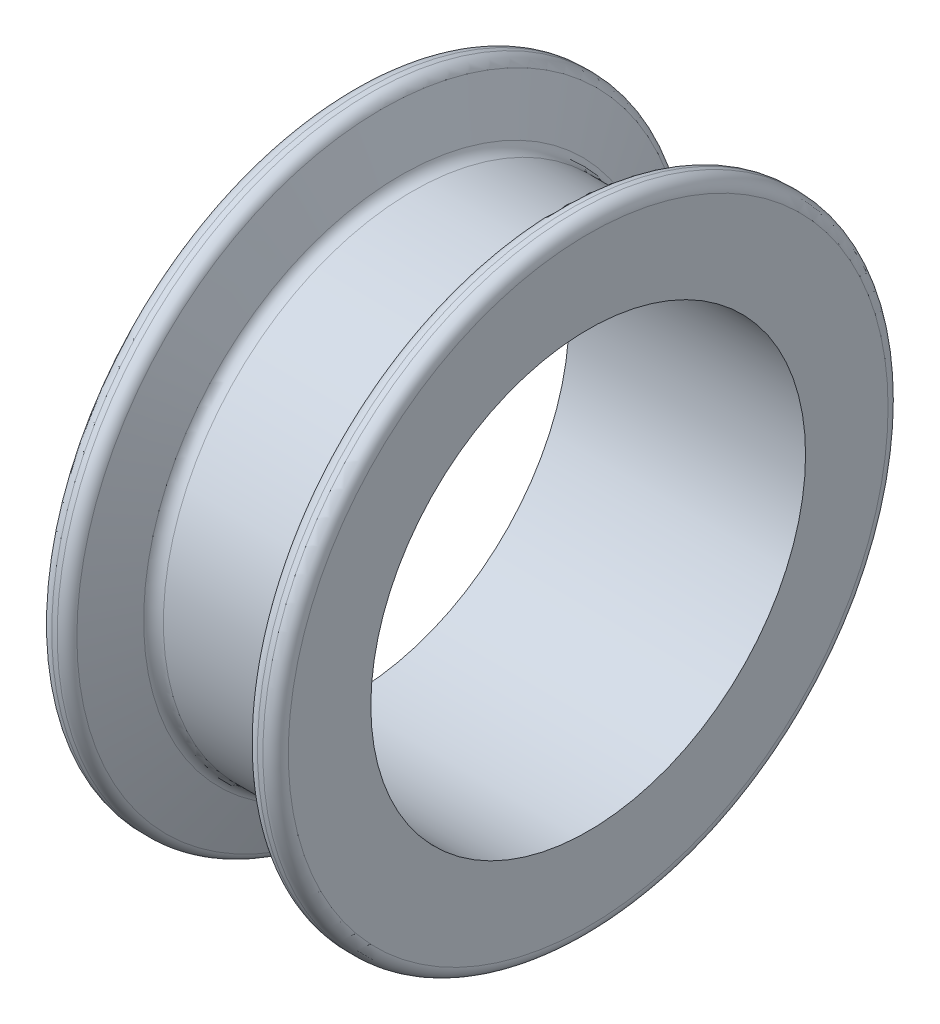
ISO-10303-21;
HEADER;
FILE_DESCRIPTION(('STEP AP214'),'2;1');
FILE_NAME('part.step','',(''),(''),'','','');
FILE_SCHEMA(('AUTOMOTIVE_DESIGN { 1 0 10303 214 1 1 1 1 }'));
ENDSEC;
DATA;
#1=APPLICATION_CONTEXT('core data for automotive mechanical design processes');
#2=APPLICATION_PROTOCOL_DEFINITION('international standard','automotive_design',2000,#1);
#3=PRODUCT_CONTEXT('',#1,'mechanical');
#4=PRODUCT('Part','Part','',(#3));
#5=PRODUCT_RELATED_PRODUCT_CATEGORY('part','',(#4));
#6=PRODUCT_DEFINITION_FORMATION('','',#4);
#7=PRODUCT_DEFINITION_CONTEXT('part definition',#1,'design');
#8=PRODUCT_DEFINITION('design','',#6,#7);
#9=PRODUCT_DEFINITION_SHAPE('','',#8);
#10=(LENGTH_UNIT() NAMED_UNIT(*) SI_UNIT(.MILLI.,.METRE.));
#11=(NAMED_UNIT(*) PLANE_ANGLE_UNIT() SI_UNIT($,.RADIAN.));
#12=(NAMED_UNIT(*) SI_UNIT($,.STERADIAN.) SOLID_ANGLE_UNIT());
#13=UNCERTAINTY_MEASURE_WITH_UNIT(LENGTH_MEASURE(1.E-05),#10,'distance_accuracy_value','');
#14=(GEOMETRIC_REPRESENTATION_CONTEXT(3) GLOBAL_UNCERTAINTY_ASSIGNED_CONTEXT((#13)) GLOBAL_UNIT_ASSIGNED_CONTEXT((#10,
#11,#12)) REPRESENTATION_CONTEXT('',''));
#15=CARTESIAN_POINT('',(0.,0.,0.));
#16=DIRECTION('',(0.,0.,1.));
#17=DIRECTION('',(1.,0.,0.));
#18=AXIS2_PLACEMENT_3D('',#15,#16,#17);
#19=CARTESIAN_POINT('',(215.569737886982,-120.531915067261,0.));
#20=DIRECTION('',(1.,0.,0.));
#21=DIRECTION('',(0.,0.,-1.));
#22=AXIS2_PLACEMENT_3D('',#19,#20,#21);
#23=PLANE('',#22);
#24=CARTESIAN_POINT('',(215.569737886982,-113.681915067259,0.));
#25=DIRECTION('',(1.,0.,0.));
#26=DIRECTION('',(0.,0.,-1.));
#27=AXIS2_PLACEMENT_3D('',#24,#25,#26);
#28=CIRCLE('',#27,9.45000000000008);
#29=CARTESIAN_POINT('',(215.569737886982,-113.681915067259,-9.45000000000008));
#30=VERTEX_POINT('',#29);
#31=EDGE_CURVE('E10',#30,#30,#28,.T.);
#32=ORIENTED_EDGE('',*,*,#31,.F.);
#33=EDGE_LOOP('',(#32));
#34=FACE_BOUND('',#33,.T.);
#35=CARTESIAN_POINT('',(215.569737886982,-113.681915067259,0.));
#36=DIRECTION('',(1.,0.,0.));
#37=DIRECTION('',(0.,0.,-1.));
#38=AXIS2_PLACEMENT_3D('',#35,#36,#37);
#39=CIRCLE('',#38,6.85000000000109);
#40=CARTESIAN_POINT('',(215.569737886982,-113.681915067259,-6.85000000000109));
#41=VERTEX_POINT('',#40);
#42=EDGE_CURVE('E80',#41,#41,#39,.T.);
#43=ORIENTED_EDGE('',*,*,#42,.T.);
#44=EDGE_LOOP('',(#43));
#45=FACE_BOUND('',#44,.T.);
#46=ADVANCED_FACE('F34',(#34,#45),#23,.F.);
#47=CARTESIAN_POINT('',(215.969737886982,-113.681915067259,0.));
#48=DIRECTION('',(1.,0.,0.));
#49=DIRECTION('',(0.,0.,-1.));
#50=AXIS2_PLACEMENT_3D('',#47,#48,#49);
#51=TOROIDAL_SURFACE('',#50,9.45000000000008,0.400000000000018);
#52=CARTESIAN_POINT('',(215.969737886982,-113.681915067259,0.));
#53=DIRECTION('',(1.,0.,0.));
#54=DIRECTION('',(0.,0.,-1.));
#55=AXIS2_PLACEMENT_3D('',#52,#53,#54);
#56=CIRCLE('',#55,9.85000000000008);
#57=CARTESIAN_POINT('',(215.969737886982,-113.681915067259,-9.85000000000008));
#58=VERTEX_POINT('',#57);
#59=EDGE_CURVE('E40',#58,#58,#56,.T.);
#60=ORIENTED_EDGE('',*,*,#59,.F.);
#61=EDGE_LOOP('',(#60));
#62=FACE_BOUND('',#61,.T.);
#63=ORIENTED_EDGE('',*,*,#31,.T.);
#64=EDGE_LOOP('',(#63));
#65=FACE_BOUND('',#64,.T.);
#66=ADVANCED_FACE('F153',(#62,#65),#51,.T.);
#67=CARTESIAN_POINT('',(220.434983076149,-113.681915067259,0.));
#68=DIRECTION('',(1.,0.,0.));
#69=DIRECTION('',(0.,0.,-1.));
#70=AXIS2_PLACEMENT_3D('',#67,#68,#69);
#71=CYLINDRICAL_SURFACE('',#70,9.85000000000008);
#72=CARTESIAN_POINT('',(216.140466235807,-113.681915067259,0.));
#73=DIRECTION('',(1.,0.,0.));
#74=DIRECTION('',(0.,0.,-1.));
#75=AXIS2_PLACEMENT_3D('',#72,#73,#74);
#76=CIRCLE('',#75,9.85000000000008);
#77=CARTESIAN_POINT('',(216.140466235807,-113.681915067259,-9.85000000000008));
#78=VERTEX_POINT('',#77);
#79=EDGE_CURVE('E44',#78,#78,#76,.T.);
#80=ORIENTED_EDGE('',*,*,#79,.F.);
#81=EDGE_LOOP('',(#80));
#82=FACE_BOUND('',#81,.T.);
#83=ORIENTED_EDGE('',*,*,#59,.T.);
#84=EDGE_LOOP('',(#83));
#85=FACE_BOUND('',#84,.T.);
#86=ADVANCED_FACE('F148',(#82,#85),#71,.T.);
#87=CARTESIAN_POINT('',(216.140466235807,-113.681915067259,0.));
#88=DIRECTION('',(1.,0.,0.));
#89=DIRECTION('',(0.,0.,-1.));
#90=AXIS2_PLACEMENT_3D('',#87,#88,#89);
#91=TOROIDAL_SURFACE('',#90,9.45000000000007,0.400000000000011);
#92=CARTESIAN_POINT('',(216.51137731439,-113.681915067259,0.));
#93=DIRECTION('',(1.,0.,0.));
#94=DIRECTION('',(0.,0.,-1.));
#95=AXIS2_PLACEMENT_3D('',#92,#93,#94);
#96=CIRCLE('',#95,9.59974969711037);
#97=CARTESIAN_POINT('',(216.51137731439,-113.681915067259,-9.59974969711037));
#98=VERTEX_POINT('',#97);
#99=EDGE_CURVE('E48',#98,#98,#96,.T.);
#100=ORIENTED_EDGE('',*,*,#99,.F.);
#101=EDGE_LOOP('',(#100));
#102=FACE_BOUND('',#101,.T.);
#103=ORIENTED_EDGE('',*,*,#79,.T.);
#104=EDGE_LOOP('',(#103));
#105=FACE_BOUND('',#104,.T.);
#106=ADVANCED_FACE('F142',(#102,#105),#91,.T.);
#107=CARTESIAN_POINT('',(216.51137731439,-113.681915067259,0.));
#108=DIRECTION('',(-1.,0.,0.));
#109=DIRECTION('',(0.,0.,1.));
#110=AXIS2_PLACEMENT_3D('',#107,#108,#109);
#111=CONICAL_SURFACE('',#110,9.59974969711037,1.18707447691162);
#112=CARTESIAN_POINT('',(217.116777349783,-113.681915067259,0.));
#113=DIRECTION('',(1.,0.,0.));
#114=DIRECTION('',(0.,0.,-1.));
#115=AXIS2_PLACEMENT_3D('',#112,#113,#114);
#116=CIRCLE('',#115,8.10025030288976);
#117=CARTESIAN_POINT('',(217.116777349783,-113.681915067259,-8.10025030288976));
#118=VERTEX_POINT('',#117);
#119=EDGE_CURVE('E53',#118,#118,#116,.T.);
#120=ORIENTED_EDGE('',*,*,#119,.F.);
#121=EDGE_LOOP('',(#120));
#122=FACE_BOUND('',#121,.T.);
#123=ORIENTED_EDGE('',*,*,#99,.T.);
#124=EDGE_LOOP('',(#123));
#125=FACE_BOUND('',#124,.T.);
#126=ADVANCED_FACE('F136',(#122,#125),#111,.T.);
#127=CARTESIAN_POINT('',(217.487688428365,-113.681915067259,0.));
#128=DIRECTION('',(1.,0.,0.));
#129=DIRECTION('',(0.,0.,-1.));
#130=AXIS2_PLACEMENT_3D('',#127,#128,#129);
#131=TOROIDAL_SURFACE('',#130,8.25000000000006,0.400000000000004);
#132=CARTESIAN_POINT('',(217.487688428365,-113.681915067259,0.));
#133=DIRECTION('',(1.,0.,0.));
#134=DIRECTION('',(0.,0.,-1.));
#135=AXIS2_PLACEMENT_3D('',#132,#133,#134);
#136=CIRCLE('',#135,7.85000000000007);
#137=CARTESIAN_POINT('',(217.487688428365,-113.681915067259,-7.85000000000007));
#138=VERTEX_POINT('',#137);
#139=EDGE_CURVE('E56',#138,#138,#136,.T.);
#140=ORIENTED_EDGE('',*,*,#139,.F.);
#141=EDGE_LOOP('',(#140));
#142=FACE_BOUND('',#141,.T.);
#143=ORIENTED_EDGE('',*,*,#119,.T.);
#144=EDGE_LOOP('',(#143));
#145=FACE_BOUND('',#144,.T.);
#146=ADVANCED_FACE('F130',(#142,#145),#131,.F.);
#147=CARTESIAN_POINT('',(220.434983076149,-113.681915067259,0.));
#148=DIRECTION('',(1.,0.,0.));
#149=DIRECTION('',(0.,0.,-1.));
#150=AXIS2_PLACEMENT_3D('',#147,#148,#149);
#151=CYLINDRICAL_SURFACE('',#150,7.85000000000007);
#152=CARTESIAN_POINT('',(221.106239276029,-113.681915067259,0.));
#153=DIRECTION('',(1.,0.,0.));
#154=DIRECTION('',(0.,0.,-1.));
#155=AXIS2_PLACEMENT_3D('',#152,#153,#154);
#156=CIRCLE('',#155,7.85000000000007);
#157=CARTESIAN_POINT('',(221.106239276029,-113.681915067259,-7.85000000000007));
#158=VERTEX_POINT('',#157);
#159=EDGE_CURVE('E59',#158,#158,#156,.T.);
#160=ORIENTED_EDGE('',*,*,#159,.F.);
#161=EDGE_LOOP('',(#160));
#162=FACE_BOUND('',#161,.T.);
#163=ORIENTED_EDGE('',*,*,#139,.T.);
#164=EDGE_LOOP('',(#163));
#165=FACE_BOUND('',#164,.T.);
#166=ADVANCED_FACE('F124',(#162,#165),#151,.T.);
#167=CARTESIAN_POINT('',(221.106239276029,-113.681915067259,0.));
#168=DIRECTION('',(1.,0.,0.));
#169=DIRECTION('',(0.,0.,-1.));
#170=AXIS2_PLACEMENT_3D('',#167,#168,#169);
#171=TOROIDAL_SURFACE('',#170,8.25000000000006,0.400000000000004);
#172=CARTESIAN_POINT('',(221.477150354611,-113.681915067259,0.));
#173=DIRECTION('',(1.,0.,0.));
#174=DIRECTION('',(0.,0.,-1.));
#175=AXIS2_PLACEMENT_3D('',#172,#173,#174);
#176=CIRCLE('',#175,8.10025030288976);
#177=CARTESIAN_POINT('',(221.477150354611,-113.681915067259,-8.10025030288976));
#178=VERTEX_POINT('',#177);
#179=EDGE_CURVE('E62',#178,#178,#176,.T.);
#180=ORIENTED_EDGE('',*,*,#179,.F.);
#181=EDGE_LOOP('',(#180));
#182=FACE_BOUND('',#181,.T.);
#183=ORIENTED_EDGE('',*,*,#159,.T.);
#184=EDGE_LOOP('',(#183));
#185=FACE_BOUND('',#184,.T.);
#186=ADVANCED_FACE('F118',(#182,#185),#171,.F.);
#187=CARTESIAN_POINT('',(221.477150354611,-113.681915067259,0.));
#188=DIRECTION('',(1.,0.,0.));
#189=DIRECTION('',(0.,0.,-1.));
#190=AXIS2_PLACEMENT_3D('',#187,#188,#189);
#191=CONICAL_SURFACE('',#190,8.10025030288976,1.18707447691162);
#192=CARTESIAN_POINT('',(222.082550390004,-113.681915067259,0.));
#193=DIRECTION('',(1.,0.,0.));
#194=DIRECTION('',(0.,0.,-1.));
#195=AXIS2_PLACEMENT_3D('',#192,#193,#194);
#196=CIRCLE('',#195,9.59974969711037);
#197=CARTESIAN_POINT('',(222.082550390004,-113.681915067259,-9.59974969711037));
#198=VERTEX_POINT('',#197);
#199=EDGE_CURVE('E65',#198,#198,#196,.T.);
#200=ORIENTED_EDGE('',*,*,#199,.F.);
#201=EDGE_LOOP('',(#200));
#202=FACE_BOUND('',#201,.T.);
#203=ORIENTED_EDGE('',*,*,#179,.T.);
#204=EDGE_LOOP('',(#203));
#205=FACE_BOUND('',#204,.T.);
#206=ADVANCED_FACE('F112',(#202,#205),#191,.T.);
#207=CARTESIAN_POINT('',(222.453461468587,-113.681915067259,0.));
#208=DIRECTION('',(1.,0.,0.));
#209=DIRECTION('',(0.,0.,-1.));
#210=AXIS2_PLACEMENT_3D('',#207,#208,#209);
#211=TOROIDAL_SURFACE('',#210,9.45000000000007,0.400000000000011);
#212=CARTESIAN_POINT('',(222.453461468587,-113.681915067259,0.));
#213=DIRECTION('',(1.,0.,0.));
#214=DIRECTION('',(0.,0.,-1.));
#215=AXIS2_PLACEMENT_3D('',#212,#213,#214);
#216=CIRCLE('',#215,9.85000000000008);
#217=CARTESIAN_POINT('',(222.453461468587,-113.681915067259,-9.85000000000008));
#218=VERTEX_POINT('',#217);
#219=EDGE_CURVE('E68',#218,#218,#216,.T.);
#220=ORIENTED_EDGE('',*,*,#219,.F.);
#221=EDGE_LOOP('',(#220));
#222=FACE_BOUND('',#221,.T.);
#223=ORIENTED_EDGE('',*,*,#199,.T.);
#224=EDGE_LOOP('',(#223));
#225=FACE_BOUND('',#224,.T.);
#226=ADVANCED_FACE('F106',(#222,#225),#211,.T.);
#227=CARTESIAN_POINT('',(220.434983076149,-113.681915067259,0.));
#228=DIRECTION('',(1.,0.,0.));
#229=DIRECTION('',(0.,0.,-1.));
#230=AXIS2_PLACEMENT_3D('',#227,#228,#229);
#231=CYLINDRICAL_SURFACE('',#230,9.8500000000001);
#232=CARTESIAN_POINT('',(222.624189817412,-113.681915067259,0.));
#233=DIRECTION('',(1.,0.,0.));
#234=DIRECTION('',(0.,0.,-1.));
#235=AXIS2_PLACEMENT_3D('',#232,#233,#234);
#236=CIRCLE('',#235,9.85000000000011);
#237=CARTESIAN_POINT('',(222.624189817412,-113.681915067259,-9.85000000000011));
#238=VERTEX_POINT('',#237);
#239=EDGE_CURVE('E71',#238,#238,#236,.T.);
#240=ORIENTED_EDGE('',*,*,#239,.F.);
#241=EDGE_LOOP('',(#240));
#242=FACE_BOUND('',#241,.T.);
#243=ORIENTED_EDGE('',*,*,#219,.T.);
#244=EDGE_LOOP('',(#243));
#245=FACE_BOUND('',#244,.T.);
#246=ADVANCED_FACE('F100',(#242,#245),#231,.T.);
#247=CARTESIAN_POINT('',(222.624189817412,-113.681915067259,0.));
#248=DIRECTION('',(1.,0.,0.));
#249=DIRECTION('',(0.,0.,-1.));
#250=AXIS2_PLACEMENT_3D('',#247,#248,#249);
#251=TOROIDAL_SURFACE('',#250,9.45000000000008,0.400000000000018);
#252=CARTESIAN_POINT('',(223.024189817412,-113.681915067259,0.));
#253=DIRECTION('',(1.,0.,0.));
#254=DIRECTION('',(0.,0.,-1.));
#255=AXIS2_PLACEMENT_3D('',#252,#253,#254);
#256=CIRCLE('',#255,9.45000000000008);
#257=CARTESIAN_POINT('',(223.024189817412,-113.681915067259,-9.45000000000008));
#258=VERTEX_POINT('',#257);
#259=EDGE_CURVE('E74',#258,#258,#256,.T.);
#260=ORIENTED_EDGE('',*,*,#259,.F.);
#261=EDGE_LOOP('',(#260));
#262=FACE_BOUND('',#261,.T.);
#263=ORIENTED_EDGE('',*,*,#239,.T.);
#264=EDGE_LOOP('',(#263));
#265=FACE_BOUND('',#264,.T.);
#266=ADVANCED_FACE('F94',(#262,#265),#251,.T.);
#267=CARTESIAN_POINT('',(223.024189817412,-120.531915067261,0.));
#268=DIRECTION('',(-1.,0.,0.));
#269=DIRECTION('',(0.,0.,1.));
#270=AXIS2_PLACEMENT_3D('',#267,#268,#269);
#271=PLANE('',#270);
#272=CARTESIAN_POINT('',(223.024189817412,-113.681915067259,0.));
#273=DIRECTION('',(1.,0.,0.));
#274=DIRECTION('',(0.,0.,-1.));
#275=AXIS2_PLACEMENT_3D('',#272,#273,#274);
#276=CIRCLE('',#275,6.85000000000109);
#277=CARTESIAN_POINT('',(223.024189817412,-113.681915067259,-6.85000000000109));
#278=VERTEX_POINT('',#277);
#279=EDGE_CURVE('E77',#278,#278,#276,.T.);
#280=ORIENTED_EDGE('',*,*,#279,.F.);
#281=EDGE_LOOP('',(#280));
#282=FACE_BOUND('',#281,.T.);
#283=ORIENTED_EDGE('',*,*,#259,.T.);
#284=EDGE_LOOP('',(#283));
#285=FACE_BOUND('',#284,.T.);
#286=ADVANCED_FACE('F88',(#282,#285),#271,.F.);
#287=CARTESIAN_POINT('',(220.434983076149,-113.681915067259,0.));
#288=DIRECTION('',(1.,0.,0.));
#289=DIRECTION('',(0.,0.,-1.));
#290=AXIS2_PLACEMENT_3D('',#287,#288,#289);
#291=CYLINDRICAL_SURFACE('',#290,6.85000000000109);
#292=ORIENTED_EDGE('',*,*,#42,.F.);
#293=EDGE_LOOP('',(#292));
#294=FACE_BOUND('',#293,.T.);
#295=ORIENTED_EDGE('',*,*,#279,.T.);
#296=EDGE_LOOP('',(#295));
#297=FACE_BOUND('',#296,.T.);
#298=ADVANCED_FACE('F85',(#294,#297),#291,.F.);
#299=CLOSED_SHELL('',(#46,#66,#86,#106,#126,#146,#166,#186,#206,#226,#246,#266,#286,#298));
#300=MANIFOLD_SOLID_BREP('B2',#299);
#301=ADVANCED_BREP_SHAPE_REPRESENTATION('',(#18,#300),#14);
#302=SHAPE_DEFINITION_REPRESENTATION(#9,#301);
ENDSEC;
END-ISO-10303-21;
